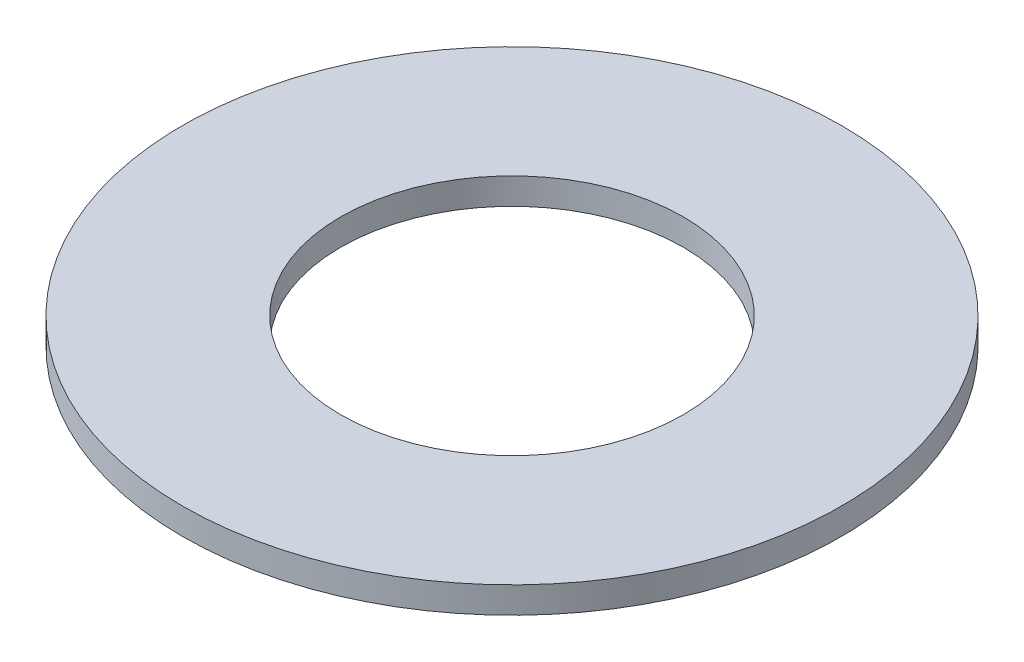
ISO-10303-21;
HEADER;
FILE_DESCRIPTION(('STEP AP214'),'2;1');
FILE_NAME('part.step','',(''),(''),'','','');
FILE_SCHEMA(('AUTOMOTIVE_DESIGN { 1 0 10303 214 1 1 1 1 }'));
ENDSEC;
DATA;
#1=APPLICATION_CONTEXT('core data for automotive mechanical design processes');
#2=APPLICATION_PROTOCOL_DEFINITION('international standard','automotive_design',2000,#1);
#3=PRODUCT_CONTEXT('',#1,'mechanical');
#4=PRODUCT('Part','Part','',(#3));
#5=PRODUCT_RELATED_PRODUCT_CATEGORY('part','',(#4));
#6=PRODUCT_DEFINITION_FORMATION('','',#4);
#7=PRODUCT_DEFINITION_CONTEXT('part definition',#1,'design');
#8=PRODUCT_DEFINITION('design','',#6,#7);
#9=PRODUCT_DEFINITION_SHAPE('','',#8);
#10=(LENGTH_UNIT() NAMED_UNIT(*) SI_UNIT(.MILLI.,.METRE.));
#11=(NAMED_UNIT(*) PLANE_ANGLE_UNIT() SI_UNIT($,.RADIAN.));
#12=(NAMED_UNIT(*) SI_UNIT($,.STERADIAN.) SOLID_ANGLE_UNIT());
#13=UNCERTAINTY_MEASURE_WITH_UNIT(LENGTH_MEASURE(1.E-05),#10,'distance_accuracy_value','');
#14=(GEOMETRIC_REPRESENTATION_CONTEXT(3) GLOBAL_UNCERTAINTY_ASSIGNED_CONTEXT((#13)) GLOBAL_UNIT_ASSIGNED_CONTEXT((#10,
#11,#12)) REPRESENTATION_CONTEXT('',''));
#15=CARTESIAN_POINT('',(0.,0.,0.));
#16=DIRECTION('',(0.,0.,1.));
#17=DIRECTION('',(1.,0.,0.));
#18=AXIS2_PLACEMENT_3D('',#15,#16,#17);
#19=CARTESIAN_POINT('',(0.,0.,0.));
#20=DIRECTION('',(0.,1.,0.));
#21=DIRECTION('',(0.,0.,1.));
#22=AXIS2_PLACEMENT_3D('',#19,#20,#21);
#23=PLANE('',#22);
#24=CARTESIAN_POINT('',(0.,0.,0.));
#25=DIRECTION('',(0.,-1.,0.));
#26=DIRECTION('',(0.,0.,-1.));
#27=AXIS2_PLACEMENT_3D('',#24,#25,#26);
#28=CIRCLE('',#27,6.5);
#29=CARTESIAN_POINT('',(0.,0.,-6.5));
#30=VERTEX_POINT('',#29);
#31=EDGE_CURVE('E27',#30,#30,#28,.F.);
#32=ORIENTED_EDGE('',*,*,#31,.T.);
#33=EDGE_LOOP('',(#32));
#34=FACE_BOUND('',#33,.T.);
#35=CARTESIAN_POINT('',(0.,0.,0.));
#36=DIRECTION('',(0.,-1.,0.));
#37=DIRECTION('',(0.,0.,-1.));
#38=AXIS2_PLACEMENT_3D('',#35,#36,#37);
#39=CIRCLE('',#38,12.5);
#40=CARTESIAN_POINT('',(0.,0.,-12.5));
#41=VERTEX_POINT('',#40);
#42=EDGE_CURVE('E18',#41,#41,#39,.F.);
#43=ORIENTED_EDGE('',*,*,#42,.F.);
#44=EDGE_LOOP('',(#43));
#45=FACE_BOUND('',#44,.T.);
#46=ADVANCED_FACE('F15',(#34,#45),#23,.F.);
#47=CARTESIAN_POINT('',(0.,1.,0.));
#48=DIRECTION('',(0.,-1.,0.));
#49=DIRECTION('',(0.,0.,-1.));
#50=AXIS2_PLACEMENT_3D('',#47,#48,#49);
#51=CYLINDRICAL_SURFACE('',#50,12.5);
#52=ORIENTED_EDGE('',*,*,#42,.T.);
#53=EDGE_LOOP('',(#52));
#54=FACE_BOUND('',#53,.T.);
#55=CARTESIAN_POINT('',(0.,1.,0.));
#56=DIRECTION('',(0.,-1.,0.));
#57=DIRECTION('',(0.,0.,-1.));
#58=AXIS2_PLACEMENT_3D('',#55,#56,#57);
#59=CIRCLE('',#58,12.5);
#60=CARTESIAN_POINT('',(0.,1.,-12.5));
#61=VERTEX_POINT('',#60);
#62=EDGE_CURVE('E22',#61,#61,#59,.F.);
#63=ORIENTED_EDGE('',*,*,#62,.F.);
#64=EDGE_LOOP('',(#63));
#65=FACE_BOUND('',#64,.T.);
#66=ADVANCED_FACE('F35',(#54,#65),#51,.T.);
#67=CARTESIAN_POINT('',(0.,1.,0.));
#68=DIRECTION('',(0.,-1.,0.));
#69=DIRECTION('',(0.,0.,-1.));
#70=AXIS2_PLACEMENT_3D('',#67,#68,#69);
#71=CYLINDRICAL_SURFACE('',#70,6.5);
#72=CARTESIAN_POINT('',(0.,1.,0.));
#73=DIRECTION('',(0.,-1.,0.));
#74=DIRECTION('',(0.,0.,-1.));
#75=AXIS2_PLACEMENT_3D('',#72,#73,#74);
#76=CIRCLE('',#75,6.5);
#77=CARTESIAN_POINT('',(0.,1.,-6.5));
#78=VERTEX_POINT('',#77);
#79=EDGE_CURVE('E10',#78,#78,#76,.T.);
#80=ORIENTED_EDGE('',*,*,#79,.F.);
#81=EDGE_LOOP('',(#80));
#82=FACE_BOUND('',#81,.T.);
#83=ORIENTED_EDGE('',*,*,#31,.F.);
#84=EDGE_LOOP('',(#83));
#85=FACE_BOUND('',#84,.T.);
#86=ADVANCED_FACE('F43',(#82,#85),#71,.F.);
#87=CARTESIAN_POINT('',(0.,1.,0.));
#88=DIRECTION('',(0.,1.,0.));
#89=DIRECTION('',(0.,0.,1.));
#90=AXIS2_PLACEMENT_3D('',#87,#88,#89);
#91=PLANE('',#90);
#92=ORIENTED_EDGE('',*,*,#79,.T.);
#93=EDGE_LOOP('',(#92));
#94=FACE_BOUND('',#93,.T.);
#95=ORIENTED_EDGE('',*,*,#62,.T.);
#96=EDGE_LOOP('',(#95));
#97=FACE_BOUND('',#96,.T.);
#98=ADVANCED_FACE('F44',(#94,#97),#91,.T.);
#99=CLOSED_SHELL('',(#46,#66,#86,#98));
#100=MANIFOLD_SOLID_BREP('B1',#99);
#101=ADVANCED_BREP_SHAPE_REPRESENTATION('',(#18,#100),#14);
#102=SHAPE_DEFINITION_REPRESENTATION(#9,#101);
ENDSEC;
END-ISO-10303-21;
